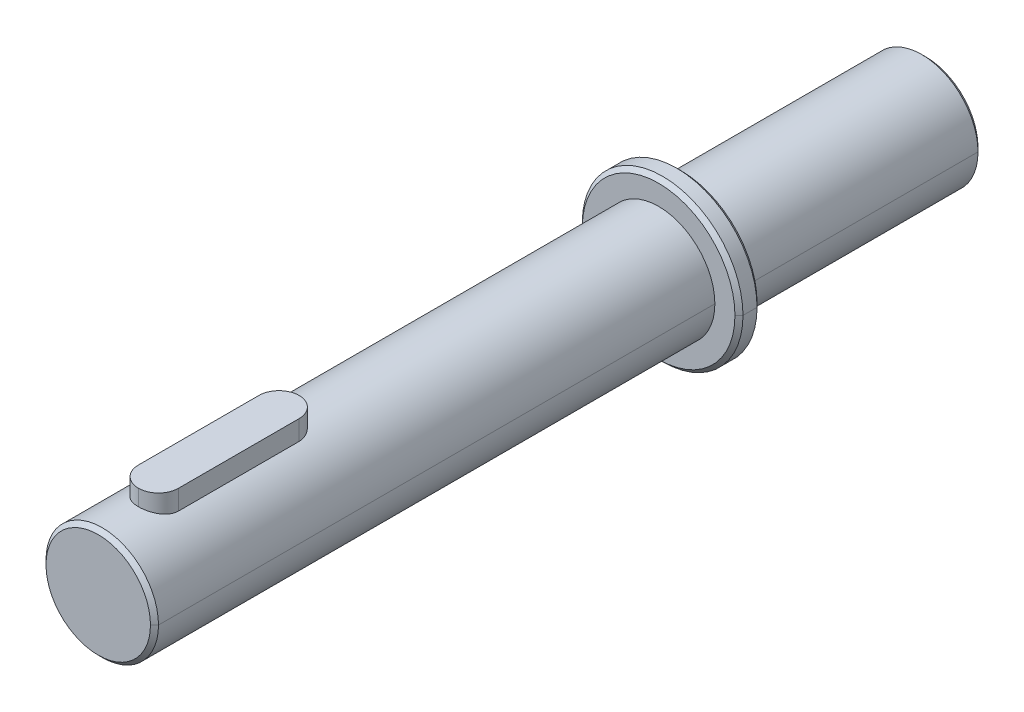
ISO-10303-21;
HEADER;
FILE_DESCRIPTION(('STEP AP214'),'2;1');
FILE_NAME('part.step','',(''),(''),'','','');
FILE_SCHEMA(('AUTOMOTIVE_DESIGN { 1 0 10303 214 1 1 1 1 }'));
ENDSEC;
DATA;
#1=APPLICATION_CONTEXT('core data for automotive mechanical design processes');
#2=APPLICATION_PROTOCOL_DEFINITION('international standard','automotive_design',2000,#1);
#3=PRODUCT_CONTEXT('',#1,'mechanical');
#4=PRODUCT('Part','Part','',(#3));
#5=PRODUCT_RELATED_PRODUCT_CATEGORY('part','',(#4));
#6=PRODUCT_DEFINITION_FORMATION('','',#4);
#7=PRODUCT_DEFINITION_CONTEXT('part definition',#1,'design');
#8=PRODUCT_DEFINITION('design','',#6,#7);
#9=PRODUCT_DEFINITION_SHAPE('','',#8);
#10=(LENGTH_UNIT() NAMED_UNIT(*) SI_UNIT(.MILLI.,.METRE.));
#11=(NAMED_UNIT(*) PLANE_ANGLE_UNIT() SI_UNIT($,.RADIAN.));
#12=(NAMED_UNIT(*) SI_UNIT($,.STERADIAN.) SOLID_ANGLE_UNIT());
#13=UNCERTAINTY_MEASURE_WITH_UNIT(LENGTH_MEASURE(1.E-05),#10,'distance_accuracy_value','');
#14=(GEOMETRIC_REPRESENTATION_CONTEXT(3) GLOBAL_UNCERTAINTY_ASSIGNED_CONTEXT((#13)) GLOBAL_UNIT_ASSIGNED_CONTEXT((#10,
#11,#12)) REPRESENTATION_CONTEXT('',''));
#15=CARTESIAN_POINT('',(0.,0.,0.));
#16=DIRECTION('',(0.,0.,1.));
#17=DIRECTION('',(1.,0.,0.));
#18=AXIS2_PLACEMENT_3D('',#15,#16,#17);
#19=CARTESIAN_POINT('',(0.,9.,80.5));
#20=DIRECTION('',(0.,1.,0.));
#21=DIRECTION('',(1.,0.,0.));
#22=AXIS2_PLACEMENT_3D('',#19,#20,#21);
#23=PLANE('',#22);
#24=CARTESIAN_POINT('',(0.,9.,80.5));
#25=DIRECTION('',(0.,1.,0.));
#26=DIRECTION('',(0.,0.,1.));
#27=AXIS2_PLACEMENT_3D('',#24,#25,#26);
#28=CIRCLE('',#27,2.5);
#29=CARTESIAN_POINT('',(2.5,9.,80.5));
#30=VERTEX_POINT('',#29);
#31=CARTESIAN_POINT('',(-2.5,9.,80.5));
#32=VERTEX_POINT('',#31);
#33=EDGE_CURVE('E368',#30,#32,#28,.T.);
#34=ORIENTED_EDGE('',*,*,#33,.T.);
#35=DIRECTION('',(0.,0.,1.));
#36=VECTOR('',#35,1.);
#37=CARTESIAN_POINT('',(-2.5,9.,80.5));
#38=LINE('',#37,#36);
#39=CARTESIAN_POINT('',(-2.5,9.,95.5));
#40=VERTEX_POINT('',#39);
#41=EDGE_CURVE('E11',#32,#40,#38,.T.);
#42=ORIENTED_EDGE('',*,*,#41,.T.);
#43=CARTESIAN_POINT('',(0.,9.,95.5));
#44=DIRECTION('',(0.,1.,0.));
#45=DIRECTION('',(0.,0.,1.));
#46=AXIS2_PLACEMENT_3D('',#43,#44,#45);
#47=CIRCLE('',#46,2.5);
#48=CARTESIAN_POINT('',(0.,9.,98.));
#49=VERTEX_POINT('',#48);
#50=EDGE_CURVE('E242',#40,#49,#47,.T.);
#51=ORIENTED_EDGE('',*,*,#50,.T.);
#52=CARTESIAN_POINT('',(0.,9.,95.5));
#53=DIRECTION('',(0.,1.,0.));
#54=DIRECTION('',(0.,0.,1.));
#55=AXIS2_PLACEMENT_3D('',#52,#53,#54);
#56=CIRCLE('',#55,2.5);
#57=CARTESIAN_POINT('',(2.5,9.,95.5));
#58=VERTEX_POINT('',#57);
#59=EDGE_CURVE('E27',#49,#58,#56,.T.);
#60=ORIENTED_EDGE('',*,*,#59,.T.);
#61=DIRECTION('',(0.,0.,-1.));
#62=VECTOR('',#61,1.);
#63=CARTESIAN_POINT('',(2.5,9.,80.5));
#64=LINE('',#63,#62);
#65=EDGE_CURVE('E372',#58,#30,#64,.T.);
#66=ORIENTED_EDGE('',*,*,#65,.T.);
#67=EDGE_LOOP('',(#34,#42,#51,#60,#66));
#68=FACE_BOUND('',#67,.T.);
#69=ADVANCED_FACE('F17',(#68),#23,.T.);
#70=CARTESIAN_POINT('',(-2.5,5.,80.5));
#71=DIRECTION('',(-1.,0.,0.));
#72=DIRECTION('',(0.,0.,1.));
#73=AXIS2_PLACEMENT_3D('',#70,#71,#72);
#74=PLANE('',#73);
#75=DIRECTION('',(0.,0.,-1.));
#76=VECTOR('',#75,1.);
#77=CARTESIAN_POINT('',(-2.5,6.53834841531101,103.));
#78=LINE('',#77,#76);
#79=CARTESIAN_POINT('',(-2.5,6.53834841531101,95.5));
#80=VERTEX_POINT('',#79);
#81=CARTESIAN_POINT('',(-2.5,6.53834841531101,80.5));
#82=VERTEX_POINT('',#81);
#83=EDGE_CURVE('E178',#80,#82,#78,.T.);
#84=ORIENTED_EDGE('',*,*,#83,.F.);
#85=DIRECTION('',(0.,1.,0.));
#86=VECTOR('',#85,1.);
#87=CARTESIAN_POINT('',(-2.5,5.,95.5));
#88=LINE('',#87,#86);
#89=EDGE_CURVE('E199',#80,#40,#88,.T.);
#90=ORIENTED_EDGE('',*,*,#89,.T.);
#91=ORIENTED_EDGE('',*,*,#41,.F.);
#92=DIRECTION('',(0.,1.,0.));
#93=VECTOR('',#92,1.);
#94=CARTESIAN_POINT('',(-2.5,5.,80.5));
#95=LINE('',#94,#93);
#96=EDGE_CURVE('E301',#82,#32,#95,.T.);
#97=ORIENTED_EDGE('',*,*,#96,.F.);
#98=EDGE_LOOP('',(#84,#90,#91,#97));
#99=FACE_BOUND('',#98,.T.);
#100=ADVANCED_FACE('F316',(#99),#74,.T.);
#101=CARTESIAN_POINT('',(0.,5.,95.5));
#102=DIRECTION('',(0.,1.,0.));
#103=DIRECTION('',(0.,0.,1.));
#104=AXIS2_PLACEMENT_3D('',#101,#102,#103);
#105=CYLINDRICAL_SURFACE('',#104,2.5);
#106=DIRECTION('',(0.,1.,0.));
#107=VECTOR('',#106,1.);
#108=CARTESIAN_POINT('',(0.,5.,98.));
#109=LINE('',#108,#107);
#110=CARTESIAN_POINT('',(0.,7.,98.));
#111=VERTEX_POINT('',#110);
#112=EDGE_CURVE('E245',#111,#49,#109,.T.);
#113=ORIENTED_EDGE('',*,*,#112,.F.);
#114=CARTESIAN_POINT('',(2.50000000000001,6.53834841531101,95.5));
#115=CARTESIAN_POINT('',(2.49999486460904,6.53834922140623,95.5411488813042));
#116=CARTESIAN_POINT('',(2.49897926588543,6.53873866144585,95.5822979467637));
#117=CARTESIAN_POINT('',(2.49492893917991,6.54028579850625,95.6644038169697));
#118=CARTESIAN_POINT('',(2.49189804250053,6.54144203774676,95.705360838308));
#119=CARTESIAN_POINT('',(2.48381536216645,6.54451517266332,95.7870827021745));
#120=CARTESIAN_POINT('',(2.4787618079414,6.54643273476544,95.8278473445843));
#121=CARTESIAN_POINT('',(2.46663474545564,6.55101178436475,95.9091847019735));
#122=CARTESIAN_POINT('',(2.45955394477967,6.55367595682436,95.9497561765607));
#123=CARTESIAN_POINT('',(2.44343580281927,6.5597023849742,96.0303925460274));
#124=CARTESIAN_POINT('',(2.43440139853854,6.56306359245005,96.0704581068151));
#125=CARTESIAN_POINT('',(2.41437652650804,6.57045659954532,96.1500684719737));
#126=CARTESIAN_POINT('',(2.40338452783162,6.57448892384546,96.1896128425655));
#127=CARTESIAN_POINT('',(2.37943864876051,6.58319333645167,96.2681819027061));
#128=CARTESIAN_POINT('',(2.36647813241883,6.58786758339313,96.3072043293981));
#129=CARTESIAN_POINT('',(2.33858869203233,6.59781958806596,96.3847315041636));
#130=CARTESIAN_POINT('',(2.32364830623555,6.60310083418245,96.4232316770509));
#131=CARTESIAN_POINT('',(2.2920951943404,6.61411944714842,96.4989837265194));
#132=CARTESIAN_POINT('',(2.27550198657626,6.619851353491,96.5362445335371));
#133=CARTESIAN_POINT('',(2.24052032976708,6.63177278992483,96.6098919228128));
#134=CARTESIAN_POINT('',(2.22212985850232,6.637962833552,96.6462774615535));
#135=CARTESIAN_POINT('',(2.18354481453471,6.65075533940521,96.7181763587574));
#136=CARTESIAN_POINT('',(2.16334401109668,6.65735920046183,96.7536861232325));
#137=CARTESIAN_POINT('',(2.12112871853377,6.67093001624926,96.8238362370843));
#138=CARTESIAN_POINT('',(2.09910409870006,6.67789890743501,96.8584701115403));
#139=CARTESIAN_POINT('',(2.05370049842169,6.69200064559508,96.9261688535272));
#140=CARTESIAN_POINT('',(2.03034152768185,6.69913041823493,96.9592477872515));
#141=CARTESIAN_POINT('',(1.98206655648059,6.7135718212934,97.0241983097895));
#142=CARTESIAN_POINT('',(1.95715085549373,6.72088341657213,97.0560701289374));
#143=CARTESIAN_POINT('',(1.90575489974834,6.73563764680118,97.1186089528073));
#144=CARTESIAN_POINT('',(1.87927151004406,6.74308052188658,97.1492733241778));
#145=CARTESIAN_POINT('',(1.824732836244,6.75804357264462,97.2094003832824));
#146=CARTESIAN_POINT('',(1.79667126506749,6.76556394326396,97.238857317581));
#147=CARTESIAN_POINT('',(1.73911161419911,6.78058825702909,97.2964275988394));
#148=CARTESIAN_POINT('',(1.70961146392506,6.78809215921747,97.3245388864071));
#149=CARTESIAN_POINT('',(1.649324073343,6.8029913907538,97.3792325008186));
#150=CARTESIAN_POINT('',(1.61853986573819,6.8103869257379,97.4058181130666));
#151=CARTESIAN_POINT('',(1.55568191819345,6.82501978130301,97.4574634528221));
#152=CARTESIAN_POINT('',(1.52360820513562,6.83225710517737,97.4825232121116));
#153=CARTESIAN_POINT('',(1.45816963792438,6.84652211299038,97.5311205983708));
#154=CARTESIAN_POINT('',(1.42480209312886,6.85354929956493,97.5546547477383));
#155=CARTESIAN_POINT('',(1.3570539123516,6.8672843916076,97.6000145749498));
#156=CARTESIAN_POINT('',(1.32267770037468,6.873993428198,97.621846516431));
#157=CARTESIAN_POINT('',(1.25297947743487,6.88703815093173,97.6637493988738));
#158=CARTESIAN_POINT('',(1.21766151247708,6.89337514704277,97.683826657589));
#159=CARTESIAN_POINT('',(1.14608428844182,6.90563589693738,97.7222239251048));
#160=CARTESIAN_POINT('',(1.10982655824981,6.91156027040986,97.7405465852404));
#161=CARTESIAN_POINT('',(1.03637506420662,6.9229552106729,97.7754387993647));
#162=CARTESIAN_POINT('',(0.99918064757727,6.92842544889108,97.7920070863896));
#163=CARTESIAN_POINT('',(0.923610134804952,6.93890579193744,97.8234967629514));
#164=CARTESIAN_POINT('',(0.885226117640738,6.94391096961873,97.8384007954195));
#165=CARTESIAN_POINT('',(0.807864268264771,6.95333497956832,97.8662529017036));
#166=CARTESIAN_POINT('',(0.768889526642059,6.95775613814103,97.8792087660204));
#167=CARTESIAN_POINT('',(0.690356831753166,6.96598617743431,97.9031691298857));
#168=CARTESIAN_POINT('',(0.650800029337571,6.9697961251078,97.9141770334096));
#169=CARTESIAN_POINT('',(0.571114205747451,6.97677784854782,97.9342463247737));
#170=CARTESIAN_POINT('',(0.530984849093481,6.9799492322067,97.9433065168592));
#171=CARTESIAN_POINT('',(0.450250540740271,6.9856219022247,97.9594658737224));
#172=CARTESIAN_POINT('',(0.409645214741269,6.98812261830549,97.96656336975));
#173=CARTESIAN_POINT('',(0.32822547867363,6.99241910420697,97.9787229319513));
#174=CARTESIAN_POINT('',(0.287412140493888,6.99421708513368,97.9837913836096));
#175=CARTESIAN_POINT('',(0.205590032927375,6.99709982428988,97.9918969739911));
#176=CARTESIAN_POINT('',(0.164581432304507,6.99818511430059,97.9949356272971));
#177=CARTESIAN_POINT('',(0.0823819349926322,6.99963647038599,97.9989906530845));
#178=CARTESIAN_POINT('',(0.0411908471282914,7.00000131422071,98.0000035889648));
#179=CARTESIAN_POINT('',(0.,7.,98.));
#180=B_SPLINE_CURVE_WITH_KNOTS('',3,(#114,#115,#116,#117,#118,#119,#120,#121,#122,#123,#124,
#125,#126,#127,#128,#129,#130,#131,#132,#133,#134,#135,#136,#137,#138,#139,#140,#141,#142,#143,
#144,#145,#146,#147,#148,#149,#150,#151,#152,#153,#154,#155,#156,#157,#158,#159,#160,#161,#162,
#163,#164,#165,#166,#167,#168,#169,#170,#171,#172,#173,#174,#175,#176,#177,#178,#179),
.UNSPECIFIED.,.F.,.F.,(4,2,2,2,2,2,2,2,2,2,2,2,2,2,2,2,2,2,2,2,2,2,2,2,2,2,2,2,2,2,2,2,4),(0.,
0.123432960321374,0.246631929422802,0.369938979693912,0.493695286713717,0.61726681898911,
0.740935417537534,0.865030560450793,0.9898783473794,1.11339566910803,1.23705360443757,
1.36115480835721,1.48599871040141,1.60930578396483,1.73258920904528,1.85612809071379,
1.98019980876655,2.10445570447246,2.22843312675693,2.35240796584286,2.47665612838534,
2.60042309878643,2.72372431449825,2.84683617100204,2.97003633794453,3.09442047527897,
3.21829317188441,3.34194722167536,3.46567697072104,3.58951159776647,3.71295338944673,
3.83630296886554,3.95986163219396),.UNSPECIFIED.);
#181=CARTESIAN_POINT('',(2.5,6.53834841531101,95.5));
#182=VERTEX_POINT('',#181);
#183=EDGE_CURVE('E254',#182,#111,#180,.T.);
#184=ORIENTED_EDGE('',*,*,#183,.F.);
#185=DIRECTION('',(0.,1.,0.));
#186=VECTOR('',#185,1.);
#187=CARTESIAN_POINT('',(2.5,5.,95.5));
#188=LINE('',#187,#186);
#189=EDGE_CURVE('E399',#182,#58,#188,.T.);
#190=ORIENTED_EDGE('',*,*,#189,.T.);
#191=ORIENTED_EDGE('',*,*,#59,.F.);
#192=EDGE_LOOP('',(#113,#184,#190,#191));
#193=FACE_BOUND('',#192,.T.);
#194=ADVANCED_FACE('F272',(#193),#105,.T.);
#195=CARTESIAN_POINT('',(2.5,5.,80.5));
#196=DIRECTION('',(1.,0.,0.));
#197=DIRECTION('',(0.,0.,1.));
#198=AXIS2_PLACEMENT_3D('',#195,#196,#197);
#199=PLANE('',#198);
#200=DIRECTION('',(0.,0.,1.));
#201=VECTOR('',#200,1.);
#202=CARTESIAN_POINT('',(2.5,6.53834841531101,103.));
#203=LINE('',#202,#201);
#204=CARTESIAN_POINT('',(2.5,6.53834841531101,80.5));
#205=VERTEX_POINT('',#204);
#206=EDGE_CURVE('E445',#205,#182,#203,.T.);
#207=ORIENTED_EDGE('',*,*,#206,.F.);
#208=DIRECTION('',(0.,1.,0.));
#209=VECTOR('',#208,1.);
#210=CARTESIAN_POINT('',(2.5,5.,80.5));
#211=LINE('',#210,#209);
#212=EDGE_CURVE('E377',#205,#30,#211,.T.);
#213=ORIENTED_EDGE('',*,*,#212,.T.);
#214=ORIENTED_EDGE('',*,*,#65,.F.);
#215=ORIENTED_EDGE('',*,*,#189,.F.);
#216=EDGE_LOOP('',(#207,#213,#214,#215));
#217=FACE_BOUND('',#216,.T.);
#218=ADVANCED_FACE('F314',(#217),#199,.T.);
#219=CARTESIAN_POINT('',(0.,5.,80.5));
#220=DIRECTION('',(0.,1.,0.));
#221=DIRECTION('',(0.,0.,1.));
#222=AXIS2_PLACEMENT_3D('',#219,#220,#221);
#223=CYLINDRICAL_SURFACE('',#222,2.5);
#224=CARTESIAN_POINT('',(-2.5,6.53834841531101,80.5));
#225=CARTESIAN_POINT('',(-2.4999945961891,6.53834930046182,80.4586422767436));
#226=CARTESIAN_POINT('',(-2.49896858390629,6.53874274489908,80.4172843601896));
#227=CARTESIAN_POINT('',(-2.49487713103959,6.54030557519709,80.3347641053461));
#228=CARTESIAN_POINT('',(-2.49181561879444,6.54147346643114,80.2936015438496));
#229=CARTESIAN_POINT('',(-2.48365136694751,6.54457743794098,80.2114719248902));
#230=CARTESIAN_POINT('',(-2.47854684083283,6.5465141905353,80.1705050703741));
#231=CARTESIAN_POINT('',(-2.46629754330455,6.5511388060438,80.0887665553137));
#232=CARTESIAN_POINT('',(-2.45914535250998,6.55382939960629,80.047996163017));
#233=CARTESIAN_POINT('',(-2.44293407528496,6.55988926794573,79.9673123537091));
#234=CARTESIAN_POINT('',(-2.43389469014594,6.56325151646742,79.927394445732));
#235=CARTESIAN_POINT('',(-2.41387371807141,6.57064133600655,79.8480768545457));
#236=CARTESIAN_POINT('',(-2.40289058681747,6.57466943587793,79.8086776103594));
#237=CARTESIAN_POINT('',(-2.37897635748208,6.58336037593245,79.7303963191023));
#238=CARTESIAN_POINT('',(-2.36603868363146,6.58802535348985,79.6915165194173));
#239=CARTESIAN_POINT('',(-2.33820886268395,6.59795413341405,79.6142721374125));
#240=CARTESIAN_POINT('',(-2.32330538304755,6.60322138234847,79.5759120851336));
#241=CARTESIAN_POINT('',(-2.29181409943729,6.6142168029623,79.500374775884));
#242=CARTESIAN_POINT('',(-2.27524287298128,6.61994033950563,79.4631899281072));
#243=CARTESIAN_POINT('',(-2.24031221595385,6.63184302119215,79.389691368525));
#244=CARTESIAN_POINT('',(-2.22195076972259,6.63802267794775,79.353378697399));
#245=CARTESIAN_POINT('',(-2.18343084742244,6.65079264969555,79.2816224445585));
#246=CARTESIAN_POINT('',(-2.16326618022866,6.65738435412214,79.2461824348954));
#247=CARTESIAN_POINT('',(-2.12113026355131,6.67092938496769,79.1761688087182));
#248=CARTESIAN_POINT('',(-2.09914895291464,6.67788463434977,79.1416016231919));
#249=CARTESIAN_POINT('',(-2.05370462333403,6.69199970301811,79.0738324846028));
#250=CARTESIAN_POINT('',(-2.03025212024752,6.69915790607505,79.0406231407984));
#251=CARTESIAN_POINT('',(-1.9817782009331,6.71365733540343,78.9754219719953));
#252=CARTESIAN_POINT('',(-1.9567571079537,6.72099852377939,78.9434298983161));
#253=CARTESIAN_POINT('',(-1.90513836110225,6.73581251706556,78.8806607256407));
#254=CARTESIAN_POINT('',(-1.87853754156981,6.74328556361095,78.8498862873189));
#255=CARTESIAN_POINT('',(-1.82375196134445,6.75830887742135,78.7895491214711));
#256=CARTESIAN_POINT('',(-1.79556083406849,6.76585933900381,78.7599922251264));
#257=CARTESIAN_POINT('',(-1.73803001463059,6.78086483248336,78.7025318651033));
#258=CARTESIAN_POINT('',(-1.70870267958173,6.78832011792535,78.6746160942812));
#259=CARTESIAN_POINT('',(-1.6487773437734,6.80312306881541,78.6202941278598));
#260=CARTESIAN_POINT('',(-1.61818229817902,6.81047093589153,78.5938847287246));
#261=CARTESIAN_POINT('',(-1.55571920996257,6.82501032501814,78.5425724580424));
#262=CARTESIAN_POINT('',(-1.52385119363206,6.83220185029293,78.5176695554074));
#263=CARTESIAN_POINT('',(-1.45884055224738,6.84637811817006,78.4693667113098));
#264=CARTESIAN_POINT('',(-1.4256953039963,6.85336237664789,78.4459701589752));
#265=CARTESIAN_POINT('',(-1.35801046640804,6.86709615285198,78.4005996555708));
#266=CARTESIAN_POINT('',(-1.3234620046309,6.87384340952709,78.3786382510251));
#267=CARTESIAN_POINT('',(-1.25340929887436,6.88696086584347,78.3364950666851));
#268=CARTESIAN_POINT('',(-1.21790918050655,6.89333239946949,78.3163068483775));
#269=CARTESIAN_POINT('',(-1.14595766838103,6.90565790866749,78.277706270126));
#270=CARTESIAN_POINT('',(-1.10950782893179,6.91161251410076,78.2592912149157));
#271=CARTESIAN_POINT('',(-1.03566223001321,6.92306295801572,78.2242326513813));
#272=CARTESIAN_POINT('',(-0.998265797587934,6.92855845745104,78.2075904498442));
#273=CARTESIAN_POINT('',(-0.922672550112144,6.93902950386658,78.176134443132));
#274=CARTESIAN_POINT('',(-0.884476338047284,6.94400542675167,78.1613193146754));
#275=CARTESIAN_POINT('',(-0.807496012878599,6.95337668608261,78.1336253551054));
#276=CARTESIAN_POINT('',(-0.768714932859672,6.95777430766106,78.1207388733041));
#277=CARTESIAN_POINT('',(-0.690575363732611,6.96596340299588,78.0968976589982));
#278=CARTESIAN_POINT('',(-0.651218007552393,6.96975592710308,78.0859395756251));
#279=CARTESIAN_POINT('',(-0.57193672858392,6.97670930577821,78.0659504107935));
#280=CARTESIAN_POINT('',(-0.532012480963179,6.97986978112907,78.0569204859743));
#281=CARTESIAN_POINT('',(-0.451401461578995,6.98554811895606,78.0407436266358));
#282=CARTESIAN_POINT('',(-0.410711135242006,6.98806058344081,78.0336124942888));
#283=CARTESIAN_POINT('',(-0.32911793921576,6.99237764136441,78.0213945167781));
#284=CARTESIAN_POINT('',(-0.288216137109048,6.99418443127658,78.0163013271092));
#285=CARTESIAN_POINT('',(-0.206213646758727,6.99708210144584,78.0081540183045));
#286=CARTESIAN_POINT('',(-0.165113118235808,6.99817348323097,78.0050984706787));
#287=CARTESIAN_POINT('',(-0.0827265694400007,6.99963261252672,78.0010211818601));
#288=CARTESIAN_POINT('',(-0.0414403504041458,6.99999908993694,78.0000030103049));
#289=CARTESIAN_POINT('',(0.0411323099146131,7.00000090667417,77.9999969991836));
#290=CARTESIAN_POINT('',(0.08241875119768,6.99963624536145,78.0010091613941));
#291=CARTESIAN_POINT('',(0.164814036899808,6.99818058272282,78.0050766980954));
#292=CARTESIAN_POINT('',(0.205923057456947,6.99709070888693,78.0081289009619));
#293=CARTESIAN_POINT('',(0.287950797661165,6.99419545846158,78.0162711609568));
#294=CARTESIAN_POINT('',(0.328869312260944,6.99238943751185,78.0213630533578));
#295=CARTESIAN_POINT('',(0.41050432922965,6.9880728809328,78.0335794962313));
#296=CARTESIAN_POINT('',(0.451219696851404,6.9855600071954,78.0407107939192));
#297=CARTESIAN_POINT('',(0.531916916293951,6.97987741824582,78.0568977036228));
#298=CARTESIAN_POINT('',(0.571901925212041,6.97671250041949,78.0659392726416));
#299=CARTESIAN_POINT('',(0.651310329178912,6.96974768777569,78.0859612639224));
#300=CARTESIAN_POINT('',(0.690733944038375,6.9659480493369,78.096940903453));
#301=CARTESIAN_POINT('',(0.769011672423788,6.95774193361457,78.1208341419963));
#302=CARTESIAN_POINT('',(0.807864516224967,6.95333427984592,78.1337514947492));
#303=CARTESIAN_POINT('',(0.884994210471334,6.9439398903141,78.1615155530102));
#304=CARTESIAN_POINT('',(0.923267859852301,6.93895074248659,78.1763703276839));
#305=CARTESIAN_POINT('',(0.998951700395698,6.92845968497125,78.2078879163732));
#306=CARTESIAN_POINT('',(1.0363626104576,6.92295822297755,78.2245491538355));
#307=CARTESIAN_POINT('',(1.11024211709368,6.91149471683602,78.2596523566905));
#308=CARTESIAN_POINT('',(1.14671120867149,6.90553292148802,78.2780933614874));
#309=CARTESIAN_POINT('',(1.21870635407397,6.89319164848909,78.3167518261601));
#310=CARTESIAN_POINT('',(1.25423064932396,6.88681145942279,78.336972332875));
#311=CARTESIAN_POINT('',(1.3243371368422,6.87367502158572,78.3791856229403));
#312=CARTESIAN_POINT('',(1.3589149779279,6.86691736684954,78.4011851907479));
#313=CARTESIAN_POINT('',(1.42668783055247,6.85315614068874,78.4466566921698));
#314=CARTESIAN_POINT('',(1.45989064308894,6.84615455272655,78.4701176029656));
#315=CARTESIAN_POINT('',(1.52501544365964,6.83194237839001,78.5185607452429));
#316=CARTESIAN_POINT('',(1.55693984829439,6.82473223549407,78.5435398574483));
#317=CARTESIAN_POINT('',(1.61951506213412,6.81015442344376,78.5950156119457));
#318=CARTESIAN_POINT('',(1.65016559586184,6.80278672073311,78.6215125795609));
#319=CARTESIAN_POINT('',(1.71020174484888,6.78794288963114,78.6760203237366));
#320=CARTESIAN_POINT('',(1.73958411717175,6.78046654187785,78.704034610824));
#321=CARTESIAN_POINT('',(1.79706350119553,6.7654599171199,78.7615455412398));
#322=CARTESIAN_POINT('',(1.82515555261842,6.75792954287422,78.7910471170235));
#323=CARTESIAN_POINT('',(1.87975467436403,6.74294599251081,78.8512731280306));
#324=CARTESIAN_POINT('',(1.90626778706441,6.73549262628281,78.8819920361019));
#325=CARTESIAN_POINT('',(1.95772307578548,6.72071689252952,78.9446491953852));
#326=CARTESIAN_POINT('',(1.98266810467784,6.7133943055446,78.9765850518106));
#327=CARTESIAN_POINT('',(2.03100217006353,6.69893028514059,79.0416725736497));
#328=CARTESIAN_POINT('',(2.05439059342472,6.69178892378181,79.0748247102618));
#329=CARTESIAN_POINT('',(2.0997689703759,6.67768968830688,79.1425580899845));
#330=CARTESIAN_POINT('',(2.12174441565462,6.67073404876382,79.1771495223566));
#331=CARTESIAN_POINT('',(2.16386924226242,6.65718835455747,79.2472192136326));
#332=CARTESIAN_POINT('',(2.18402838754175,6.65059642945005,79.2826912372406));
#333=CARTESIAN_POINT('',(2.22253835794711,6.63782595704479,79.3545187449879));
#334=CARTESIAN_POINT('',(2.24089504652815,6.63164609188901,79.3908708501127));
#335=CARTESIAN_POINT('',(2.27581787925739,6.61974267857833,79.4644552917058));
#336=CARTESIAN_POINT('',(2.29238568943143,6.61401870716526,79.5016867691037));
#337=CARTESIAN_POINT('',(2.32379945779698,6.60304733229808,79.5771586985185));
#338=CARTESIAN_POINT('',(2.33863648958545,6.59780242733872,79.6154032317726));
#339=CARTESIAN_POINT('',(2.36634699587408,6.58791448176027,79.692420899681));
#340=CARTESIAN_POINT('',(2.37923132566949,6.58326813710123,79.7311897004552));
#341=CARTESIAN_POINT('',(2.40305285973659,6.5746100342189,79.8092530526285));
#342=CARTESIAN_POINT('',(2.41399619876069,6.57059628125716,79.8485455097233));
#343=CARTESIAN_POINT('',(2.43395186664817,6.56323025768717,79.9276535584654));
#344=CARTESIAN_POINT('',(2.44296535160247,6.55987759114675,79.9674688216632));
#345=CARTESIAN_POINT('',(2.45915399641925,6.55382615379035,80.0480383565042));
#346=CARTESIAN_POINT('',(2.46630494165618,6.55113601875567,80.0887981490608));
#347=CARTESIAN_POINT('',(2.47855187783586,6.54651228300983,80.1705196286813));
#348=CARTESIAN_POINT('',(2.48365508992112,6.54457602455287,80.2114800813767));
#349=CARTESIAN_POINT('',(2.49181749531009,6.5414727508365,80.2936009370829));
#350=CARTESIAN_POINT('',(2.49487826987158,6.54030514049816,80.3347611605035));
#351=CARTESIAN_POINT('',(2.49896889920525,6.53874262434975,80.4172808388327));
#352=CARTESIAN_POINT('',(2.49999462137404,6.53834929088493,80.4586405285203));
#353=CARTESIAN_POINT('',(2.50000000000001,6.53834841531101,80.5));
#354=B_SPLINE_CURVE_WITH_KNOTS('',3,(#224,#225,#226,#227,#228,#229,#230,#231,#232,#233,#234,
#235,#236,#237,#238,#239,#240,#241,#242,#243,#244,#245,#246,#247,#248,#249,#250,#251,#252,#253,
#254,#255,#256,#257,#258,#259,#260,#261,#262,#263,#264,#265,#266,#267,#268,#269,#270,#271,#272,
#273,#274,#275,#276,#277,#278,#279,#280,#281,#282,#283,#284,#285,#286,#287,#288,#289,#290,#291,
#292,#293,#294,#295,#296,#297,#298,#299,#300,#301,#302,#303,#304,#305,#306,#307,#308,#309,#310,
#311,#312,#313,#314,#315,#316,#317,#318,#319,#320,#321,#322,#323,#324,#325,#326,#327,#328,#329,
#330,#331,#332,#333,#334,#335,#336,#337,#338,#339,#340,#341,#342,#343,#344,#345,#346,#347,#348,
#349,#350,#351,#352,#353),.UNSPECIFIED.,.F.,.F.,(4,2,2,2,2,2,2,2,2,2,2,2,2,2,2,2,2,2,2,2,2,2,2,
2,2,2,2,2,2,2,2,2,2,2,2,2,2,2,2,2,2,2,2,2,2,2,2,2,2,2,2,2,2,2,2,2,2,2,2,2,2,2,2,2,4),(0.,
0.124059302180846,0.24787987294086,0.371808955956799,0.496192885505677,0.619338005611833,
0.742581408154284,0.866249079555607,0.990663669865626,1.11394506894782,1.2373669132601,
1.36123009543383,1.48583230920717,1.60962770841331,1.73339767970691,1.85742464413077,
1.98198927339233,2.10545269181489,2.22864292491484,2.3518306149938,2.4752864203317,
2.59970703063697,2.72365537786643,2.8474122426184,2.97125970754156,3.09501694086983,
3.21826943465306,3.34130559815338,3.46441536096375,3.58851973411154,3.7122346831006,
3.83586281023609,3.95970735424468,4.08355200661644,4.20720456581608,4.33096863597229,
4.45514700331832,4.57844242447327,4.70168816357812,4.825175813635,4.94919526139032,
5.07310733191873,5.19695289333391,5.3210147879242,5.4455743845853,5.56928743507829,
5.69275437778229,5.81624788300323,5.94004044627074,6.06427470598992,6.18799812075885,
6.31148950573185,6.43502924837791,6.55968272378565,6.6836201827731,6.80714009394356,
6.93054395730771,7.05455849200023,7.17785611087584,7.30075680414124,7.42358366571091,
7.54793557471464,7.67184503084374,7.79565844446504,7.91972303105147),.UNSPECIFIED.);
#355=EDGE_CURVE('E295',#82,#205,#354,.T.);
#356=ORIENTED_EDGE('',*,*,#355,.F.);
#357=ORIENTED_EDGE('',*,*,#96,.T.);
#358=ORIENTED_EDGE('',*,*,#33,.F.);
#359=ORIENTED_EDGE('',*,*,#212,.F.);
#360=EDGE_LOOP('',(#356,#357,#358,#359));
#361=FACE_BOUND('',#360,.T.);
#362=ADVANCED_FACE('F303',(#361),#223,.T.);
#363=CARTESIAN_POINT('',(0.,0.,32.75));
#364=DIRECTION('',(0.,0.,-1.));
#365=DIRECTION('',(-1.,0.,0.));
#366=AXIS2_PLACEMENT_3D('',#363,#364,#365);
#367=CONICAL_SURFACE('',#366,10.,0.785398163397428);
#368=DIRECTION('',(0.707106781186533,0.,-0.707106781186562));
#369=VECTOR('',#368,1.);
#370=CARTESIAN_POINT('',(10.,0.,32.75));
#371=LINE('',#370,#369);
#372=CARTESIAN_POINT('',(9.5,0.,33.25));
#373=VERTEX_POINT('',#372);
#374=CARTESIAN_POINT('',(10.,0.,32.75));
#375=VERTEX_POINT('',#374);
#376=EDGE_CURVE('E198',#373,#375,#371,.T.);
#377=ORIENTED_EDGE('',*,*,#376,.F.);
#378=CARTESIAN_POINT('',(0.,0.,33.25));
#379=DIRECTION('',(0.,0.,1.));
#380=DIRECTION('',(-1.,0.,0.));
#381=AXIS2_PLACEMENT_3D('',#378,#379,#380);
#382=CIRCLE('',#381,9.5);
#383=CARTESIAN_POINT('',(-9.5,0.,33.25));
#384=VERTEX_POINT('',#383);
#385=EDGE_CURVE('E230',#384,#373,#382,.T.);
#386=ORIENTED_EDGE('',*,*,#385,.F.);
#387=DIRECTION('',(-0.707106781186533,0.,-0.707106781186562));
#388=VECTOR('',#387,1.);
#389=CARTESIAN_POINT('',(-10.,0.,32.75));
#390=LINE('',#389,#388);
#391=CARTESIAN_POINT('',(-10.,0.,32.75));
#392=VERTEX_POINT('',#391);
#393=EDGE_CURVE('E204',#384,#392,#390,.T.);
#394=ORIENTED_EDGE('',*,*,#393,.T.);
#395=CARTESIAN_POINT('',(0.,0.,32.75));
#396=DIRECTION('',(0.,0.,-1.));
#397=DIRECTION('',(-1.,0.,0.));
#398=AXIS2_PLACEMENT_3D('',#395,#396,#397);
#399=CIRCLE('',#398,10.);
#400=EDGE_CURVE('E210',#375,#392,#399,.T.);
#401=ORIENTED_EDGE('',*,*,#400,.F.);
#402=EDGE_LOOP('',(#377,#386,#394,#401));
#403=FACE_BOUND('',#402,.T.);
#404=ADVANCED_FACE('F313',(#403),#367,.T.);
#405=CARTESIAN_POINT('',(0.,0.,30.5));
#406=DIRECTION('',(0.,0.,1.));
#407=DIRECTION('',(1.,0.,0.));
#408=AXIS2_PLACEMENT_3D('',#405,#406,#407);
#409=CONICAL_SURFACE('',#408,9.5,0.785398163397442);
#410=DIRECTION('',(-0.707106781186543,0.,0.707106781186553));
#411=VECTOR('',#410,1.);
#412=CARTESIAN_POINT('',(-9.5,0.,30.5));
#413=LINE('',#412,#411);
#414=CARTESIAN_POINT('',(-9.5,0.,30.5));
#415=VERTEX_POINT('',#414);
#416=CARTESIAN_POINT('',(-10.,0.,31.));
#417=VERTEX_POINT('',#416);
#418=EDGE_CURVE('E203',#415,#417,#413,.T.);
#419=ORIENTED_EDGE('',*,*,#418,.F.);
#420=CARTESIAN_POINT('',(0.,0.,30.5));
#421=DIRECTION('',(0.,0.,-1.));
#422=DIRECTION('',(1.,0.,0.));
#423=AXIS2_PLACEMENT_3D('',#420,#421,#422);
#424=CIRCLE('',#423,9.5);
#425=CARTESIAN_POINT('',(9.5,0.,30.5));
#426=VERTEX_POINT('',#425);
#427=EDGE_CURVE('E229',#426,#415,#424,.T.);
#428=ORIENTED_EDGE('',*,*,#427,.F.);
#429=DIRECTION('',(0.707106781186543,0.,0.707106781186552));
#430=VECTOR('',#429,1.);
#431=CARTESIAN_POINT('',(9.5,0.,30.5));
#432=LINE('',#431,#430);
#433=CARTESIAN_POINT('',(10.,0.,31.));
#434=VERTEX_POINT('',#433);
#435=EDGE_CURVE('E169',#426,#434,#432,.T.);
#436=ORIENTED_EDGE('',*,*,#435,.T.);
#437=CARTESIAN_POINT('',(0.,0.,31.));
#438=DIRECTION('',(0.,0.,1.));
#439=DIRECTION('',(1.,0.,0.));
#440=AXIS2_PLACEMENT_3D('',#437,#438,#439);
#441=CIRCLE('',#440,10.);
#442=EDGE_CURVE('E214',#417,#434,#441,.T.);
#443=ORIENTED_EDGE('',*,*,#442,.F.);
#444=EDGE_LOOP('',(#419,#428,#436,#443));
#445=FACE_BOUND('',#444,.T.);
#446=ADVANCED_FACE('F350',(#445),#409,.T.);
#447=CARTESIAN_POINT('',(0.,0.,0.500000000000014));
#448=DIRECTION('',(0.,0.,1.));
#449=DIRECTION('',(1.,0.,0.));
#450=AXIS2_PLACEMENT_3D('',#447,#448,#449);
#451=CONICAL_SURFACE('',#450,7.,0.785398163397455);
#452=DIRECTION('',(-0.707106781186552,0.,0.707106781186543));
#453=VECTOR('',#452,1.);
#454=CARTESIAN_POINT('',(-7.,0.,0.500000000000014));
#455=LINE('',#454,#453);
#456=CARTESIAN_POINT('',(-6.5,0.,0.));
#457=VERTEX_POINT('',#456);
#458=CARTESIAN_POINT('',(-7.,0.,0.500000000000014));
#459=VERTEX_POINT('',#458);
#460=EDGE_CURVE('E132',#457,#459,#455,.T.);
#461=ORIENTED_EDGE('',*,*,#460,.F.);
#462=CARTESIAN_POINT('',(0.,0.,0.));
#463=DIRECTION('',(0.,0.,-1.));
#464=DIRECTION('',(1.,0.,0.));
#465=AXIS2_PLACEMENT_3D('',#462,#463,#464);
#466=CIRCLE('',#465,6.5);
#467=CARTESIAN_POINT('',(6.5,0.,0.));
#468=VERTEX_POINT('',#467);
#469=EDGE_CURVE('E141',#468,#457,#466,.T.);
#470=ORIENTED_EDGE('',*,*,#469,.F.);
#471=DIRECTION('',(0.707106781186552,0.,0.707106781186543));
#472=VECTOR('',#471,1.);
#473=CARTESIAN_POINT('',(7.,0.,0.500000000000014));
#474=LINE('',#473,#472);
#475=CARTESIAN_POINT('',(7.,0.,0.500000000000014));
#476=VERTEX_POINT('',#475);
#477=EDGE_CURVE('E135',#468,#476,#474,.T.);
#478=ORIENTED_EDGE('',*,*,#477,.T.);
#479=CARTESIAN_POINT('',(0.,0.,0.500000000000014));
#480=DIRECTION('',(0.,0.,1.));
#481=DIRECTION('',(1.,0.,0.));
#482=AXIS2_PLACEMENT_3D('',#479,#480,#481);
#483=CIRCLE('',#482,7.);
#484=EDGE_CURVE('E128',#459,#476,#483,.T.);
#485=ORIENTED_EDGE('',*,*,#484,.F.);
#486=EDGE_LOOP('',(#461,#470,#478,#485));
#487=FACE_BOUND('',#486,.T.);
#488=ADVANCED_FACE('F130',(#487),#451,.T.);
#489=CARTESIAN_POINT('',(0.,0.,103.));
#490=DIRECTION('',(0.,0.,-1.));
#491=DIRECTION('',(-1.,0.,0.));
#492=AXIS2_PLACEMENT_3D('',#489,#490,#491);
#493=CONICAL_SURFACE('',#492,6.5,0.785398163397455);
#494=DIRECTION('',(0.707106781186553,0.,-0.707106781186543));
#495=VECTOR('',#494,1.);
#496=CARTESIAN_POINT('',(6.5,0.,103.));
#497=LINE('',#496,#495);
#498=CARTESIAN_POINT('',(6.5,0.,103.));
#499=VERTEX_POINT('',#498);
#500=CARTESIAN_POINT('',(7.,0.,102.5));
#501=VERTEX_POINT('',#500);
#502=EDGE_CURVE('E184',#499,#501,#497,.T.);
#503=ORIENTED_EDGE('',*,*,#502,.F.);
#504=CARTESIAN_POINT('',(0.,0.,103.));
#505=DIRECTION('',(0.,0.,1.));
#506=DIRECTION('',(1.,0.,0.));
#507=AXIS2_PLACEMENT_3D('',#504,#505,#506);
#508=CIRCLE('',#507,6.5);
#509=CARTESIAN_POINT('',(-6.5,0.,103.));
#510=VERTEX_POINT('',#509);
#511=EDGE_CURVE('E238',#510,#499,#508,.T.);
#512=ORIENTED_EDGE('',*,*,#511,.F.);
#513=DIRECTION('',(-0.707106781186553,0.,-0.707106781186543));
#514=VECTOR('',#513,1.);
#515=CARTESIAN_POINT('',(-6.5,0.,103.));
#516=LINE('',#515,#514);
#517=CARTESIAN_POINT('',(-7.,0.,102.5));
#518=VERTEX_POINT('',#517);
#519=EDGE_CURVE('E189',#510,#518,#516,.T.);
#520=ORIENTED_EDGE('',*,*,#519,.T.);
#521=CARTESIAN_POINT('',(0.,0.,102.5));
#522=DIRECTION('',(0.,0.,-1.));
#523=DIRECTION('',(1.,0.,0.));
#524=AXIS2_PLACEMENT_3D('',#521,#522,#523);
#525=CIRCLE('',#524,7.);
#526=EDGE_CURVE('E379',#501,#518,#525,.T.);
#527=ORIENTED_EDGE('',*,*,#526,.F.);
#528=EDGE_LOOP('',(#503,#512,#520,#527));
#529=FACE_BOUND('',#528,.T.);
#530=ADVANCED_FACE('F344',(#529),#493,.T.);
#531=CARTESIAN_POINT('',(0.,0.,103.));
#532=DIRECTION('',(0.,0.,-1.));
#533=DIRECTION('',(-1.,0.,0.));
#534=AXIS2_PLACEMENT_3D('',#531,#532,#533);
#535=CYLINDRICAL_SURFACE('',#534,7.);
#536=DIRECTION('',(0.,0.,-1.));
#537=VECTOR('',#536,1.);
#538=CARTESIAN_POINT('',(7.,0.,103.));
#539=LINE('',#538,#537);
#540=CARTESIAN_POINT('',(7.,0.,33.25));
#541=VERTEX_POINT('',#540);
#542=EDGE_CURVE('E206',#501,#541,#539,.T.);
#543=ORIENTED_EDGE('',*,*,#542,.F.);
#544=ORIENTED_EDGE('',*,*,#526,.T.);
#545=DIRECTION('',(0.,0.,-1.));
#546=VECTOR('',#545,1.);
#547=CARTESIAN_POINT('',(-7.,0.,103.));
#548=LINE('',#547,#546);
#549=CARTESIAN_POINT('',(-7.,0.,33.25));
#550=VERTEX_POINT('',#549);
#551=EDGE_CURVE('E174',#518,#550,#548,.T.);
#552=ORIENTED_EDGE('',*,*,#551,.T.);
#553=CARTESIAN_POINT('',(0.,0.,33.25));
#554=DIRECTION('',(0.,0.,-1.));
#555=DIRECTION('',(-1.,0.,0.));
#556=AXIS2_PLACEMENT_3D('',#553,#554,#555);
#557=CIRCLE('',#556,7.);
#558=EDGE_CURVE('E234',#541,#550,#557,.T.);
#559=ORIENTED_EDGE('',*,*,#558,.F.);
#560=EDGE_LOOP('',(#543,#544,#552,#559));
#561=FACE_BOUND('',#560,.T.);
#562=ADVANCED_FACE('F333',(#561),#535,.T.);
#563=CARTESIAN_POINT('',(0.,0.,103.));
#564=DIRECTION('',(0.,0.,1.));
#565=DIRECTION('',(1.,0.,0.));
#566=AXIS2_PLACEMENT_3D('',#563,#564,#565);
#567=PLANE('',#566);
#568=ORIENTED_EDGE('',*,*,#511,.T.);
#569=CARTESIAN_POINT('',(0.,0.,103.));
#570=DIRECTION('',(0.,0.,1.));
#571=DIRECTION('',(1.,0.,0.));
#572=AXIS2_PLACEMENT_3D('',#569,#570,#571);
#573=CIRCLE('',#572,6.5);
#574=EDGE_CURVE('E180',#499,#510,#573,.T.);
#575=ORIENTED_EDGE('',*,*,#574,.T.);
#576=EDGE_LOOP('',(#568,#575));
#577=FACE_BOUND('',#576,.T.);
#578=ADVANCED_FACE('F329',(#577),#567,.T.);
#579=CARTESIAN_POINT('',(5.,0.,33.25));
#580=DIRECTION('',(0.,0.,-1.));
#581=DIRECTION('',(-1.,0.,0.));
#582=AXIS2_PLACEMENT_3D('',#579,#580,#581);
#583=PLANE('',#582);
#584=CARTESIAN_POINT('',(0.,0.,33.25));
#585=DIRECTION('',(0.,0.,-1.));
#586=DIRECTION('',(-1.,0.,0.));
#587=AXIS2_PLACEMENT_3D('',#584,#585,#586);
#588=CIRCLE('',#587,7.);
#589=EDGE_CURVE('E179',#550,#541,#588,.T.);
#590=ORIENTED_EDGE('',*,*,#589,.T.);
#591=ORIENTED_EDGE('',*,*,#558,.T.);
#592=EDGE_LOOP('',(#590,#591));
#593=FACE_BOUND('',#592,.T.);
#594=ORIENTED_EDGE('',*,*,#385,.T.);
#595=CARTESIAN_POINT('',(0.,0.,33.25));
#596=DIRECTION('',(0.,0.,1.));
#597=DIRECTION('',(-1.,0.,0.));
#598=AXIS2_PLACEMENT_3D('',#595,#596,#597);
#599=CIRCLE('',#598,9.5);
#600=EDGE_CURVE('E194',#373,#384,#599,.T.);
#601=ORIENTED_EDGE('',*,*,#600,.T.);
#602=EDGE_LOOP('',(#594,#601));
#603=FACE_BOUND('',#602,.T.);
#604=ADVANCED_FACE('F325',(#593,#603),#583,.F.);
#605=CARTESIAN_POINT('',(5.,0.,30.5));
#606=DIRECTION('',(0.,0.,1.));
#607=DIRECTION('',(1.,0.,0.));
#608=AXIS2_PLACEMENT_3D('',#605,#606,#607);
#609=PLANE('',#608);
#610=CARTESIAN_POINT('',(0.,0.,30.5));
#611=DIRECTION('',(0.,0.,1.));
#612=DIRECTION('',(1.,0.,0.));
#613=AXIS2_PLACEMENT_3D('',#610,#611,#612);
#614=CIRCLE('',#613,7.);
#615=CARTESIAN_POINT('',(-7.,0.,30.5));
#616=VERTEX_POINT('',#615);
#617=CARTESIAN_POINT('',(7.,0.,30.5));
#618=VERTEX_POINT('',#617);
#619=EDGE_CURVE('E142',#616,#618,#614,.T.);
#620=ORIENTED_EDGE('',*,*,#619,.T.);
#621=CARTESIAN_POINT('',(0.,0.,30.5));
#622=DIRECTION('',(0.,0.,1.));
#623=DIRECTION('',(1.,0.,0.));
#624=AXIS2_PLACEMENT_3D('',#621,#622,#623);
#625=CIRCLE('',#624,7.);
#626=EDGE_CURVE('E190',#618,#616,#625,.T.);
#627=ORIENTED_EDGE('',*,*,#626,.T.);
#628=EDGE_LOOP('',(#620,#627));
#629=FACE_BOUND('',#628,.T.);
#630=ORIENTED_EDGE('',*,*,#427,.T.);
#631=CARTESIAN_POINT('',(0.,0.,30.5));
#632=DIRECTION('',(0.,0.,-1.));
#633=DIRECTION('',(1.,0.,0.));
#634=AXIS2_PLACEMENT_3D('',#631,#632,#633);
#635=CIRCLE('',#634,9.5);
#636=EDGE_CURVE('E200',#415,#426,#635,.T.);
#637=ORIENTED_EDGE('',*,*,#636,.T.);
#638=EDGE_LOOP('',(#630,#637));
#639=FACE_BOUND('',#638,.T.);
#640=ADVANCED_FACE('F328',(#629,#639),#609,.F.);
#641=CARTESIAN_POINT('',(0.,0.,0.));
#642=DIRECTION('',(0.,0.,-1.));
#643=DIRECTION('',(-1.,0.,0.));
#644=AXIS2_PLACEMENT_3D('',#641,#642,#643);
#645=CYLINDRICAL_SURFACE('',#644,10.);
#646=DIRECTION('',(0.,0.,-1.));
#647=VECTOR('',#646,1.);
#648=CARTESIAN_POINT('',(10.,0.,0.));
#649=LINE('',#648,#647);
#650=EDGE_CURVE('E434',#375,#434,#649,.T.);
#651=ORIENTED_EDGE('',*,*,#650,.F.);
#652=ORIENTED_EDGE('',*,*,#400,.T.);
#653=DIRECTION('',(0.,0.,-1.));
#654=VECTOR('',#653,1.);
#655=CARTESIAN_POINT('',(-10.,0.,0.));
#656=LINE('',#655,#654);
#657=EDGE_CURVE('E192',#392,#417,#656,.T.);
#658=ORIENTED_EDGE('',*,*,#657,.T.);
#659=ORIENTED_EDGE('',*,*,#442,.T.);
#660=EDGE_LOOP('',(#651,#652,#658,#659));
#661=FACE_BOUND('',#660,.T.);
#662=ADVANCED_FACE('F323',(#661),#645,.T.);
#663=CARTESIAN_POINT('',(0.,0.,0.));
#664=DIRECTION('',(0.,0.,1.));
#665=DIRECTION('',(1.,0.,0.));
#666=AXIS2_PLACEMENT_3D('',#663,#664,#665);
#667=PLANE('',#666);
#668=ORIENTED_EDGE('',*,*,#469,.T.);
#669=CARTESIAN_POINT('',(0.,0.,0.));
#670=DIRECTION('',(0.,0.,-1.));
#671=DIRECTION('',(1.,0.,0.));
#672=AXIS2_PLACEMENT_3D('',#669,#670,#671);
#673=CIRCLE('',#672,6.5);
#674=EDGE_CURVE('E161',#457,#468,#673,.T.);
#675=ORIENTED_EDGE('',*,*,#674,.T.);
#676=EDGE_LOOP('',(#668,#675));
#677=FACE_BOUND('',#676,.T.);
#678=ADVANCED_FACE('F320',(#677),#667,.F.);
#679=CARTESIAN_POINT('',(0.,0.,103.));
#680=DIRECTION('',(0.,0.,-1.));
#681=DIRECTION('',(-1.,0.,0.));
#682=AXIS2_PLACEMENT_3D('',#679,#680,#681);
#683=CYLINDRICAL_SURFACE('',#682,7.);
#684=DIRECTION('',(0.,0.,-1.));
#685=VECTOR('',#684,1.);
#686=CARTESIAN_POINT('',(7.,0.,103.));
#687=LINE('',#686,#685);
#688=EDGE_CURVE('E152',#618,#476,#687,.T.);
#689=ORIENTED_EDGE('',*,*,#688,.F.);
#690=ORIENTED_EDGE('',*,*,#619,.F.);
#691=DIRECTION('',(0.,0.,-1.));
#692=VECTOR('',#691,1.);
#693=CARTESIAN_POINT('',(-7.,0.,103.));
#694=LINE('',#693,#692);
#695=EDGE_CURVE('E145',#616,#459,#694,.T.);
#696=ORIENTED_EDGE('',*,*,#695,.T.);
#697=ORIENTED_EDGE('',*,*,#484,.T.);
#698=EDGE_LOOP('',(#689,#690,#696,#697));
#699=FACE_BOUND('',#698,.T.);
#700=ADVANCED_FACE('F147',(#699),#683,.T.);
#701=CARTESIAN_POINT('',(0.,0.,103.));
#702=DIRECTION('',(0.,0.,-1.));
#703=DIRECTION('',(-1.,0.,0.));
#704=AXIS2_PLACEMENT_3D('',#701,#702,#703);
#705=CYLINDRICAL_SURFACE('',#704,7.);
#706=ORIENTED_EDGE('',*,*,#626,.F.);
#707=ORIENTED_EDGE('',*,*,#688,.T.);
#708=CARTESIAN_POINT('',(0.,0.,0.500000000000014));
#709=DIRECTION('',(0.,0.,1.));
#710=DIRECTION('',(1.,0.,0.));
#711=AXIS2_PLACEMENT_3D('',#708,#709,#710);
#712=CIRCLE('',#711,7.);
#713=EDGE_CURVE('E154',#476,#459,#712,.T.);
#714=ORIENTED_EDGE('',*,*,#713,.T.);
#715=ORIENTED_EDGE('',*,*,#695,.F.);
#716=EDGE_LOOP('',(#706,#707,#714,#715));
#717=FACE_BOUND('',#716,.T.);
#718=ADVANCED_FACE('F155',(#717),#705,.T.);
#719=CARTESIAN_POINT('',(0.,0.,0.));
#720=DIRECTION('',(0.,0.,-1.));
#721=DIRECTION('',(-1.,0.,0.));
#722=AXIS2_PLACEMENT_3D('',#719,#720,#721);
#723=CYLINDRICAL_SURFACE('',#722,10.);
#724=CARTESIAN_POINT('',(0.,0.,32.75));
#725=DIRECTION('',(0.,0.,-1.));
#726=DIRECTION('',(-1.,0.,0.));
#727=AXIS2_PLACEMENT_3D('',#724,#725,#726);
#728=CIRCLE('',#727,10.);
#729=EDGE_CURVE('E215',#392,#375,#728,.T.);
#730=ORIENTED_EDGE('',*,*,#729,.T.);
#731=ORIENTED_EDGE('',*,*,#650,.T.);
#732=CARTESIAN_POINT('',(0.,0.,31.));
#733=DIRECTION('',(0.,0.,1.));
#734=DIRECTION('',(1.,0.,0.));
#735=AXIS2_PLACEMENT_3D('',#732,#733,#734);
#736=CIRCLE('',#735,10.);
#737=EDGE_CURVE('E420',#434,#417,#736,.T.);
#738=ORIENTED_EDGE('',*,*,#737,.T.);
#739=ORIENTED_EDGE('',*,*,#657,.F.);
#740=EDGE_LOOP('',(#730,#731,#738,#739));
#741=FACE_BOUND('',#740,.T.);
#742=ADVANCED_FACE('F271',(#741),#723,.T.);
#743=CARTESIAN_POINT('',(0.,0.,103.));
#744=DIRECTION('',(0.,0.,-1.));
#745=DIRECTION('',(-1.,0.,0.));
#746=AXIS2_PLACEMENT_3D('',#743,#744,#745);
#747=CYLINDRICAL_SURFACE('',#746,7.);
#748=ORIENTED_EDGE('',*,*,#83,.T.);
#749=ORIENTED_EDGE('',*,*,#355,.T.);
#750=ORIENTED_EDGE('',*,*,#206,.T.);
#751=ORIENTED_EDGE('',*,*,#183,.T.);
#752=CARTESIAN_POINT('',(0.,7.,98.));
#753=CARTESIAN_POINT('',(-0.0331837679242082,7.00000054526159,98.0000013463908));
#754=CARTESIAN_POINT('',(-0.0663682840508511,6.99976405434583,97.9993612743858));
#755=CARTESIAN_POINT('',(-0.132511878756666,6.99882325758398,97.9967891533266));
#756=CARTESIAN_POINT('',(-0.165471247235465,6.99812132990978,97.9948636717978));
#757=CARTESIAN_POINT('',(-0.231158319362572,6.99625914929741,97.9897210485263));
#758=CARTESIAN_POINT('',(-0.263886430035131,6.99510053507182,97.9865085243652));
#759=CARTESIAN_POINT('',(-0.32910467641193,6.99233531116247,97.9787942327305));
#760=CARTESIAN_POINT('',(-0.361595157829981,6.99072960496895,97.9742950648349));
#761=CARTESIAN_POINT('',(-0.426332414668458,6.98708031435156,97.9640094156574));
#762=CARTESIAN_POINT('',(-0.458579290027276,6.98503692086004,97.9582234956534));
#763=CARTESIAN_POINT('',(-0.522824002622564,6.98052241554115,97.9453664174169));
#764=CARTESIAN_POINT('',(-0.554821513329392,6.97805081782879,97.9382937987008));
#765=CARTESIAN_POINT('',(-0.618562616384236,6.97269001166658,97.9228653549609));
#766=CARTESIAN_POINT('',(-0.650305284978015,6.96979968903556,97.9145061025186));
#767=CARTESIAN_POINT('',(-0.713532191353706,6.9636114997812,97.8965062719601));
#768=CARTESIAN_POINT('',(-0.745014753303077,6.96031195029546,97.8868603896966));
#769=CARTESIAN_POINT('',(-0.807717495275537,6.95331527617509,97.866289425533));
#770=CARTESIAN_POINT('',(-0.838935114880842,6.94961596834408,97.8553572869112));
#771=CARTESIAN_POINT('',(-0.901103759406657,6.94182977241093,97.8322144822485));
#772=CARTESIAN_POINT('',(-0.932051227103697,6.93774027645037,97.8199951471734));
#773=CARTESIAN_POINT('',(-0.993113584648408,6.92926158199945,97.7945189542908));
#774=CARTESIAN_POINT('',(-1.02323365533061,6.92487570291446,97.7812734026702));
#775=CARTESIAN_POINT('',(-1.0827525007855,6.91581872808784,97.7537139018757));
#776=CARTESIAN_POINT('',(-1.11215411607683,6.91114915795163,97.7394055888784));
#777=CARTESIAN_POINT('',(-1.17023521818069,6.9015514808731,97.7097211903812));
#778=CARTESIAN_POINT('',(-1.19891690766795,6.89662435607662,97.6943490978094));
#779=CARTESIAN_POINT('',(-1.25555876022747,6.88653744372104,97.662539084691));
#780=CARTESIAN_POINT('',(-1.28352033354979,6.88137817557983,97.6461035107554));
#781=CARTESIAN_POINT('',(-1.33872300628395,6.87085218414817,97.6121681087563));
#782=CARTESIAN_POINT('',(-1.36596458427656,6.86548560481198,97.5946690145141));
#783=CARTESIAN_POINT('',(-1.41972902311015,6.85456946527637,97.5586082442115));
#784=CARTESIAN_POINT('',(-1.44625130729713,6.84901976573601,97.5400457506899));
#785=CARTESIAN_POINT('',(-1.49857928916756,6.83776118384883,97.501859574322));
#786=CARTESIAN_POINT('',(-1.52438325172684,6.83205197327852,97.4822336111899));
#787=CARTESIAN_POINT('',(-1.57527785008646,6.82049727815972,97.4419224832242));
#788=CARTESIAN_POINT('',(-1.60036551509259,6.8146513698252,97.4212336900547));
#789=CARTESIAN_POINT('',(-1.64982886929771,6.80284606846409,97.3787961899896));
#790=CARTESIAN_POINT('',(-1.67420028839714,6.79688624947066,97.3570426275047));
#791=CARTESIAN_POINT('',(-1.72224171391759,6.78487290567048,97.3124844226774));
#792=CARTESIAN_POINT('',(-1.74590617689964,6.7788190243151,97.2896739017662));
#793=CARTESIAN_POINT('',(-1.79203520211531,6.76676958955712,97.2434510640808));
#794=CARTESIAN_POINT('',(-1.81451120883744,6.76077427543451,97.2200501138815));
#795=CARTESIAN_POINT('',(-1.85849346025829,6.74881626983665,97.1724046358804));
#796=CARTESIAN_POINT('',(-1.8800009434906,6.74285354578987,97.1481612599983));
#797=CARTESIAN_POINT('',(-1.92205971246757,6.73098535663124,97.0988398014162));
#798=CARTESIAN_POINT('',(-1.94261087213048,6.72507989915019,97.0737616093973));
#799=CARTESIAN_POINT('',(-1.98276180470765,6.71335190479347,97.022769670207));
#800=CARTESIAN_POINT('',(-2.00236002183206,6.70752951380415,96.9968546645002));
#801=CARTESIAN_POINT('',(-2.04061274314689,6.6959913380333,96.9441910743182));
#802=CARTESIAN_POINT('',(-2.05926421913422,6.69027592823116,96.9174402091433));
#803=CARTESIAN_POINT('',(-2.09568113518361,6.67895849708619,96.8630274670548));
#804=CARTESIAN_POINT('',(-2.11343913755264,6.67335760392414,96.8353603762456));
#805=CARTESIAN_POINT('',(-2.14775302395949,6.66239289534028,96.7795275500533));
#806=CARTESIAN_POINT('',(-2.1643166779063,6.65702765748951,96.7513668726295));
#807=CARTESIAN_POINT('',(-2.19625024006277,6.64656043605838,96.6945481525936));
#808=CARTESIAN_POINT('',(-2.21162649366469,6.64145711033179,96.6658939246582));
#809=CARTESIAN_POINT('',(-2.24119601002538,6.63153696619892,96.608090287141));
#810=CARTESIAN_POINT('',(-2.2553940395849,6.62671901842878,96.5789435114689));
#811=CARTESIAN_POINT('',(-2.28260760711498,6.61739443075602,96.5201522829164));
#812=CARTESIAN_POINT('',(-2.29562624659551,6.6128869822754,96.4905093935273));
#813=CARTESIAN_POINT('',(-2.32088003367106,6.60406689877453,96.429874118051));
#814=CARTESIAN_POINT('',(-2.33308325698287,6.59976318730414,96.3988671414696));
#815=CARTESIAN_POINT('',(-2.35618100102823,6.59155216527251,96.336623971739));
#816=CARTESIAN_POINT('',(-2.36708582957035,6.58764177701799,96.3053920123229));
#817=CARTESIAN_POINT('',(-2.38758673075525,6.58023917811476,96.2426963325064));
#818=CARTESIAN_POINT('',(-2.39719140568558,6.5767442395865,96.2112357505414));
#819=CARTESIAN_POINT('',(-2.41510194214631,6.57018820631149,96.1480849494126));
#820=CARTESIAN_POINT('',(-2.42341444869676,6.56712490005489,96.1163968457107));
#821=CARTESIAN_POINT('',(-2.43874729707926,6.56144635345696,96.0527917493374));
#822=CARTESIAN_POINT('',(-2.44577220279941,6.55882953292528,96.0208759987059));
#823=CARTESIAN_POINT('',(-2.45853663951541,6.55405553403567,95.9568165353284));
#824=CARTESIAN_POINT('',(-2.46427854386714,6.55189750734467,95.9246733588978));
#825=CARTESIAN_POINT('',(-2.47448285994931,6.54805042370317,95.8601597159155));
#826=CARTESIAN_POINT('',(-2.47894538929952,6.54636132364221,95.8277892705383));
#827=CARTESIAN_POINT('',(-2.48659628725815,6.54345899055775,95.7628215442789));
#828=CARTESIAN_POINT('',(-2.48978249539341,6.54224656448054,95.730223973009));
#829=CARTESIAN_POINT('',(-2.49488471809271,6.54030260507875,95.6648023967389));
#830=CARTESIAN_POINT('',(-2.4967963144708,6.5395727445435,95.6319779985374));
#831=CARTESIAN_POINT('',(-2.49935442738992,6.53859523677355,95.5661023522283));
#832=CARTESIAN_POINT('',(-2.49999434175137,6.53835010613888,95.5330508095996));
#833=CARTESIAN_POINT('',(-2.5,6.53834841531101,95.5));
#834=B_SPLINE_CURVE_WITH_KNOTS('',3,(#752,#753,#754,#755,#756,#757,#758,#759,#760,#761,#762,
#763,#764,#765,#766,#767,#768,#769,#770,#771,#772,#773,#774,#775,#776,#777,#778,#779,#780,#781,
#782,#783,#784,#785,#786,#787,#788,#789,#790,#791,#792,#793,#794,#795,#796,#797,#798,#799,#800,
#801,#802,#803,#804,#805,#806,#807,#808,#809,#810,#811,#812,#813,#814,#815,#816,#817,#818,#819,
#820,#821,#822,#823,#824,#825,#826,#827,#828,#829,#830,#831,#832,#833),.UNSPECIFIED.,.F.,.F.,(4,
2,2,2,2,2,2,2,2,2,2,2,2,2,2,2,2,2,2,2,2,2,2,2,2,2,2,2,2,2,2,2,2,2,2,2,2,2,2,2,4),(0.,
0.0995453296886248,0.198585907135529,0.297274289455643,0.395764670385854,0.494212174034213,
0.592772126969083,0.691599325556698,0.790847315713433,0.89066770156744,0.991209497987829,
1.09076874748789,1.18983326519042,1.28854423924117,1.38704437823206,1.48547730791248,
1.58398694814348,1.6827168834576,1.78180974090899,1.88140658853162,1.98164636670185,
2.08060931255343,2.17944188710198,2.27828745503793,2.37728932490416,2.47659012881814,
2.57661374420173,2.67591346336102,2.77463933842343,2.87294404979375,2.9709822460663,
3.0717512274851,3.17165767328003,3.27086690520173,3.36954774968697,3.46787175540432,
3.56601234263785,3.6641439043894,3.76244088192936,3.86107683907335,3.96022355953952),.UNSPECIFIED.);
#835=EDGE_CURVE('E461',#111,#80,#834,.T.);
#836=ORIENTED_EDGE('',*,*,#835,.T.);
#837=EDGE_LOOP('',(#748,#749,#750,#751,#836));
#838=FACE_BOUND('',#837,.T.);
#839=CARTESIAN_POINT('',(0.,0.,102.5));
#840=DIRECTION('',(0.,0.,-1.));
#841=DIRECTION('',(1.,0.,0.));
#842=AXIS2_PLACEMENT_3D('',#839,#840,#841);
#843=CIRCLE('',#842,7.);
#844=EDGE_CURVE('E185',#518,#501,#843,.T.);
#845=ORIENTED_EDGE('',*,*,#844,.T.);
#846=ORIENTED_EDGE('',*,*,#542,.T.);
#847=ORIENTED_EDGE('',*,*,#589,.F.);
#848=ORIENTED_EDGE('',*,*,#551,.F.);
#849=EDGE_LOOP('',(#845,#846,#847,#848));
#850=FACE_BOUND('',#849,.T.);
#851=ADVANCED_FACE('F261',(#838,#850),#747,.T.);
#852=CARTESIAN_POINT('',(0.,0.,103.));
#853=DIRECTION('',(0.,0.,-1.));
#854=DIRECTION('',(-1.,0.,0.));
#855=AXIS2_PLACEMENT_3D('',#852,#853,#854);
#856=CONICAL_SURFACE('',#855,6.5,0.785398163397455);
#857=ORIENTED_EDGE('',*,*,#574,.F.);
#858=ORIENTED_EDGE('',*,*,#502,.T.);
#859=ORIENTED_EDGE('',*,*,#844,.F.);
#860=ORIENTED_EDGE('',*,*,#519,.F.);
#861=EDGE_LOOP('',(#857,#858,#859,#860));
#862=FACE_BOUND('',#861,.T.);
#863=ADVANCED_FACE('F270',(#862),#856,.T.);
#864=CARTESIAN_POINT('',(0.,0.,0.500000000000014));
#865=DIRECTION('',(0.,0.,1.));
#866=DIRECTION('',(1.,0.,0.));
#867=AXIS2_PLACEMENT_3D('',#864,#865,#866);
#868=CONICAL_SURFACE('',#867,7.,0.785398163397455);
#869=ORIENTED_EDGE('',*,*,#674,.F.);
#870=ORIENTED_EDGE('',*,*,#460,.T.);
#871=ORIENTED_EDGE('',*,*,#713,.F.);
#872=ORIENTED_EDGE('',*,*,#477,.F.);
#873=EDGE_LOOP('',(#869,#870,#871,#872));
#874=FACE_BOUND('',#873,.T.);
#875=ADVANCED_FACE('F159',(#874),#868,.T.);
#876=CARTESIAN_POINT('',(0.,0.,30.5));
#877=DIRECTION('',(0.,0.,1.));
#878=DIRECTION('',(1.,0.,0.));
#879=AXIS2_PLACEMENT_3D('',#876,#877,#878);
#880=CONICAL_SURFACE('',#879,9.5,0.785398163397442);
#881=ORIENTED_EDGE('',*,*,#636,.F.);
#882=ORIENTED_EDGE('',*,*,#418,.T.);
#883=ORIENTED_EDGE('',*,*,#737,.F.);
#884=ORIENTED_EDGE('',*,*,#435,.F.);
#885=EDGE_LOOP('',(#881,#882,#883,#884));
#886=FACE_BOUND('',#885,.T.);
#887=ADVANCED_FACE('F342',(#886),#880,.T.);
#888=CARTESIAN_POINT('',(0.,0.,32.75));
#889=DIRECTION('',(0.,0.,-1.));
#890=DIRECTION('',(-1.,0.,0.));
#891=AXIS2_PLACEMENT_3D('',#888,#889,#890);
#892=CONICAL_SURFACE('',#891,10.,0.785398163397428);
#893=ORIENTED_EDGE('',*,*,#600,.F.);
#894=ORIENTED_EDGE('',*,*,#376,.T.);
#895=ORIENTED_EDGE('',*,*,#729,.F.);
#896=ORIENTED_EDGE('',*,*,#393,.F.);
#897=EDGE_LOOP('',(#893,#894,#895,#896));
#898=FACE_BOUND('',#897,.T.);
#899=ADVANCED_FACE('F338',(#898),#892,.T.);
#900=CARTESIAN_POINT('',(0.,5.,95.5));
#901=DIRECTION('',(0.,1.,0.));
#902=DIRECTION('',(0.,0.,1.));
#903=AXIS2_PLACEMENT_3D('',#900,#901,#902);
#904=CYLINDRICAL_SURFACE('',#903,2.5);
#905=ORIENTED_EDGE('',*,*,#835,.F.);
#906=ORIENTED_EDGE('',*,*,#112,.T.);
#907=ORIENTED_EDGE('',*,*,#50,.F.);
#908=ORIENTED_EDGE('',*,*,#89,.F.);
#909=EDGE_LOOP('',(#905,#906,#907,#908));
#910=FACE_BOUND('',#909,.T.);
#911=ADVANCED_FACE('F341',(#910),#904,.T.);
#912=CLOSED_SHELL('',(#69,#100,#194,#218,#362,#404,#446,#488,#530,#562,#578,#604,#640,#662,#678,
#700,#718,#742,#851,#863,#875,#887,#899,#911));
#913=MANIFOLD_SOLID_BREP('B1',#912);
#914=ADVANCED_BREP_SHAPE_REPRESENTATION('',(#18,#913),#14);
#915=SHAPE_DEFINITION_REPRESENTATION(#9,#914);
ENDSEC;
END-ISO-10303-21;
